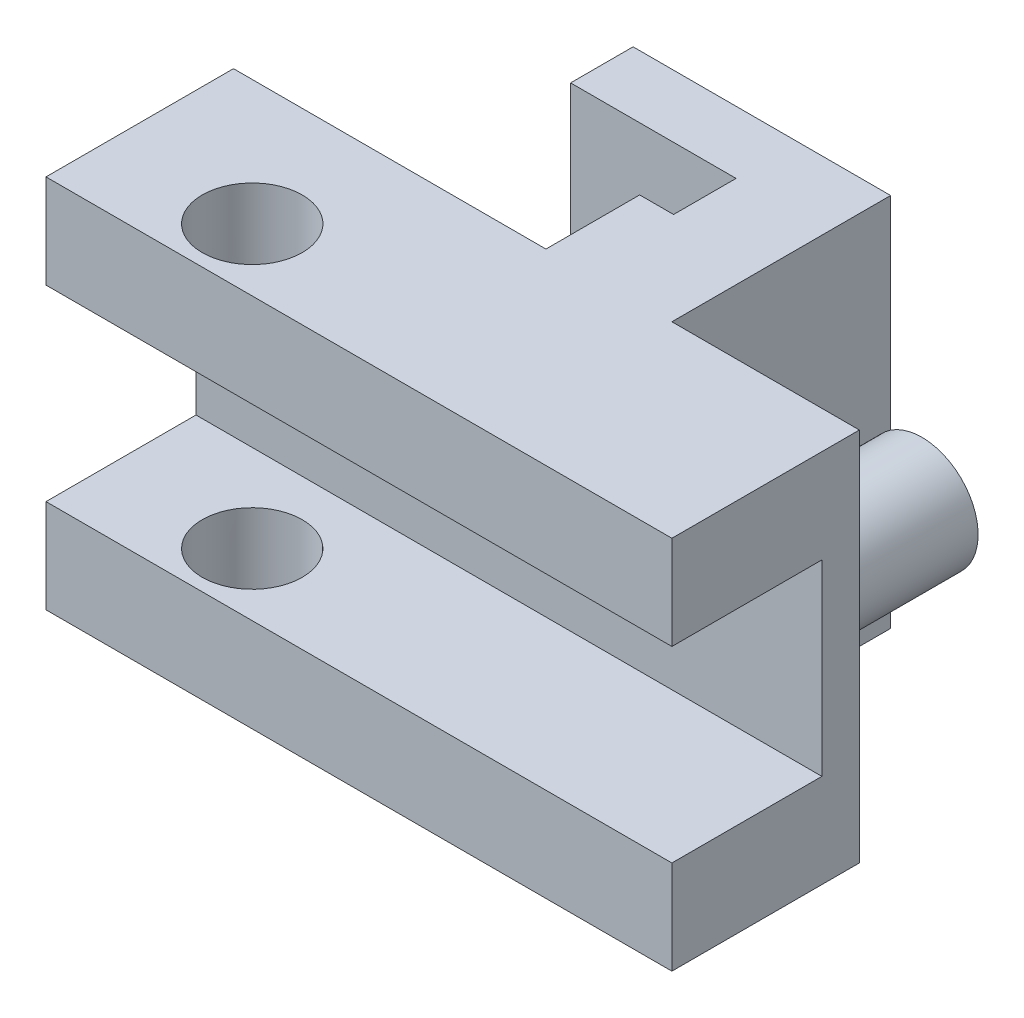
ISO-10303-21;
HEADER;
FILE_DESCRIPTION(('STEP AP214'),'2;1');
FILE_NAME('part.step','',(''),(''),'','','');
FILE_SCHEMA(('AUTOMOTIVE_DESIGN { 1 0 10303 214 1 1 1 1 }'));
ENDSEC;
DATA;
#1=APPLICATION_CONTEXT('core data for automotive mechanical design processes');
#2=APPLICATION_PROTOCOL_DEFINITION('international standard','automotive_design',2000,#1);
#3=PRODUCT_CONTEXT('',#1,'mechanical');
#4=PRODUCT('Part','Part','',(#3));
#5=PRODUCT_RELATED_PRODUCT_CATEGORY('part','',(#4));
#6=PRODUCT_DEFINITION_FORMATION('','',#4);
#7=PRODUCT_DEFINITION_CONTEXT('part definition',#1,'design');
#8=PRODUCT_DEFINITION('design','',#6,#7);
#9=PRODUCT_DEFINITION_SHAPE('','',#8);
#10=(LENGTH_UNIT() NAMED_UNIT(*) SI_UNIT(.MILLI.,.METRE.));
#11=(NAMED_UNIT(*) PLANE_ANGLE_UNIT() SI_UNIT($,.RADIAN.));
#12=(NAMED_UNIT(*) SI_UNIT($,.STERADIAN.) SOLID_ANGLE_UNIT());
#13=UNCERTAINTY_MEASURE_WITH_UNIT(LENGTH_MEASURE(1.E-05),#10,'distance_accuracy_value','');
#14=(GEOMETRIC_REPRESENTATION_CONTEXT(3) GLOBAL_UNCERTAINTY_ASSIGNED_CONTEXT((#13)) GLOBAL_UNIT_ASSIGNED_CONTEXT((#10,
#11,#12)) REPRESENTATION_CONTEXT('',''));
#15=CARTESIAN_POINT('',(0.,0.,0.));
#16=DIRECTION('',(0.,0.,1.));
#17=DIRECTION('',(1.,0.,0.));
#18=AXIS2_PLACEMENT_3D('',#15,#16,#17);
#19=CARTESIAN_POINT('',(0.,3.,-3.51853908965033));
#20=DIRECTION('',(0.,0.,-1.));
#21=DIRECTION('',(-1.,0.,0.));
#22=AXIS2_PLACEMENT_3D('',#19,#20,#21);
#23=PLANE('',#22);
#24=DIRECTION('',(1.,0.,0.));
#25=VECTOR('',#24,1.);
#26=CARTESIAN_POINT('',(0.,2.25,-3.51853908965033));
#27=LINE('',#26,#25);
#28=CARTESIAN_POINT('',(-16.7703220250574,2.25,-3.51853908965033));
#29=VERTEX_POINT('',#28);
#30=CARTESIAN_POINT('',(-11.762486372114,2.25,-3.51853908965033));
#31=VERTEX_POINT('',#30);
#32=EDGE_CURVE('E287',#29,#31,#27,.T.);
#33=ORIENTED_EDGE('',*,*,#32,.T.);
#34=DIRECTION('',(0.,-1.,0.));
#35=VECTOR('',#34,1.);
#36=CARTESIAN_POINT('',(-11.762486372114,3.,-3.51853908965033));
#37=LINE('',#36,#35);
#38=CARTESIAN_POINT('',(-11.762486372114,3.,-3.51853908965033));
#39=VERTEX_POINT('',#38);
#40=EDGE_CURVE('E239',#39,#31,#37,.T.);
#41=ORIENTED_EDGE('',*,*,#40,.F.);
#42=DIRECTION('',(1.,0.,0.));
#43=VECTOR('',#42,1.);
#44=CARTESIAN_POINT('',(0.,3.,-3.51853908965033));
#45=LINE('',#44,#43);
#46=CARTESIAN_POINT('',(-16.7703220250574,3.,-3.51853908965033));
#47=VERTEX_POINT('',#46);
#48=EDGE_CURVE('E68',#47,#39,#45,.T.);
#49=ORIENTED_EDGE('',*,*,#48,.F.);
#50=DIRECTION('',(0.,-1.,0.));
#51=VECTOR('',#50,1.);
#52=CARTESIAN_POINT('',(-16.7703220250574,3.,-3.51853908965033));
#53=LINE('',#52,#51);
#54=EDGE_CURVE('E161',#47,#29,#53,.T.);
#55=ORIENTED_EDGE('',*,*,#54,.T.);
#56=EDGE_LOOP('',(#33,#41,#49,#55));
#57=FACE_BOUND('',#56,.T.);
#58=ADVANCED_FACE('F41',(#57),#23,.F.);
#59=CARTESIAN_POINT('',(-15.6203220250574,3.,-4.01853908965033));
#60=DIRECTION('',(0.,-1.,0.));
#61=DIRECTION('',(0.,0.,-1.));
#62=AXIS2_PLACEMENT_3D('',#59,#60,#61);
#63=CYLINDRICAL_SURFACE('',#62,0.399999999999998);
#64=CARTESIAN_POINT('',(-15.6203220250574,3.,-4.01853908965033));
#65=DIRECTION('',(0.,1.,0.));
#66=DIRECTION('',(0.,0.,1.));
#67=AXIS2_PLACEMENT_3D('',#64,#65,#66);
#68=CIRCLE('',#67,0.399999999999998);
#69=CARTESIAN_POINT('',(-15.6203220250574,3.,-3.61853908965033));
#70=VERTEX_POINT('',#69);
#71=EDGE_CURVE('E186',#70,#70,#68,.T.);
#72=ORIENTED_EDGE('',*,*,#71,.T.);
#73=EDGE_LOOP('',(#72));
#74=FACE_BOUND('',#73,.T.);
#75=CARTESIAN_POINT('',(-15.6203220250574,2.25,-4.01853908965033));
#76=DIRECTION('',(0.,-1.,0.));
#77=DIRECTION('',(0.,0.,-1.));
#78=AXIS2_PLACEMENT_3D('',#75,#76,#77);
#79=CIRCLE('',#78,0.399999999999998);
#80=CARTESIAN_POINT('',(-15.6203220250574,2.25,-4.41853908965033));
#81=VERTEX_POINT('',#80);
#82=EDGE_CURVE('E267',#81,#81,#79,.T.);
#83=ORIENTED_EDGE('',*,*,#82,.T.);
#84=EDGE_LOOP('',(#83));
#85=FACE_BOUND('',#84,.T.);
#86=ADVANCED_FACE('F405',(#74,#85),#63,.F.);
#87=CARTESIAN_POINT('',(-11.762486372114,3.,0.));
#88=DIRECTION('',(1.,0.,0.));
#89=DIRECTION('',(0.,0.,-1.));
#90=AXIS2_PLACEMENT_3D('',#87,#88,#89);
#91=PLANE('',#90);
#92=DIRECTION('',(0.,0.,1.));
#93=VECTOR('',#92,1.);
#94=CARTESIAN_POINT('',(-11.762486372114,0.75,-4.71853908965033));
#95=LINE('',#94,#93);
#96=CARTESIAN_POINT('',(-11.762486372114,0.75,-4.71853908965033));
#97=VERTEX_POINT('',#96);
#98=CARTESIAN_POINT('',(-11.762486372114,0.75,-3.51853908965033));
#99=VERTEX_POINT('',#98);
#100=EDGE_CURVE('E292',#97,#99,#95,.T.);
#101=ORIENTED_EDGE('',*,*,#100,.T.);
#102=CARTESIAN_POINT('',(-11.762486372114,0.,-3.51853908965033));
#103=VERTEX_POINT('',#102);
#104=EDGE_CURVE('E113',#99,#103,#37,.T.);
#105=ORIENTED_EDGE('',*,*,#104,.T.);
#106=DIRECTION('',(0.,0.,1.));
#107=VECTOR('',#106,1.);
#108=CARTESIAN_POINT('',(-11.762486372114,0.,0.));
#109=LINE('',#108,#107);
#110=CARTESIAN_POINT('',(-11.762486372114,0.,-5.01853908965033));
#111=VERTEX_POINT('',#110);
#112=EDGE_CURVE('E190',#111,#103,#109,.T.);
#113=ORIENTED_EDGE('',*,*,#112,.F.);
#114=DIRECTION('',(0.,-1.,0.));
#115=VECTOR('',#114,1.);
#116=CARTESIAN_POINT('',(-11.762486372114,3.,-5.01853908965033));
#117=LINE('',#116,#115);
#118=CARTESIAN_POINT('',(-11.762486372114,3.,-5.01853908965033));
#119=VERTEX_POINT('',#118);
#120=EDGE_CURVE('E11',#119,#111,#117,.T.);
#121=ORIENTED_EDGE('',*,*,#120,.F.);
#122=DIRECTION('',(0.,0.,1.));
#123=VECTOR('',#122,1.);
#124=CARTESIAN_POINT('',(-11.762486372114,3.,0.));
#125=LINE('',#124,#123);
#126=EDGE_CURVE('E238',#119,#39,#125,.T.);
#127=ORIENTED_EDGE('',*,*,#126,.T.);
#128=ORIENTED_EDGE('',*,*,#40,.T.);
#129=DIRECTION('',(0.,0.,1.));
#130=VECTOR('',#129,1.);
#131=CARTESIAN_POINT('',(-11.762486372114,2.25,-4.71853908965033));
#132=LINE('',#131,#130);
#133=CARTESIAN_POINT('',(-11.762486372114,2.25,-4.71853908965033));
#134=VERTEX_POINT('',#133);
#135=EDGE_CURVE('E59',#134,#31,#132,.T.);
#136=ORIENTED_EDGE('',*,*,#135,.F.);
#137=DIRECTION('',(0.,1.,0.));
#138=VECTOR('',#137,1.);
#139=CARTESIAN_POINT('',(-11.762486372114,0.,-4.71853908965033));
#140=LINE('',#139,#138);
#141=EDGE_CURVE('E361',#97,#134,#140,.T.);
#142=ORIENTED_EDGE('',*,*,#141,.F.);
#143=EDGE_LOOP('',(#101,#105,#113,#121,#127,#128,#136,#142));
#144=FACE_BOUND('',#143,.T.);
#145=ADVANCED_FACE('F43',(#144),#91,.T.);
#146=CARTESIAN_POINT('',(0.,3.,-5.01853908965033));
#147=DIRECTION('',(0.,0.,-1.));
#148=DIRECTION('',(-1.,0.,0.));
#149=AXIS2_PLACEMENT_3D('',#146,#147,#148);
#150=PLANE('',#149);
#151=CARTESIAN_POINT('',(-12.512486372114,1.5,-5.01853908965033));
#152=DIRECTION('',(0.,0.,-1.));
#153=DIRECTION('',(-1.,0.,0.));
#154=AXIS2_PLACEMENT_3D('',#151,#152,#153);
#155=CIRCLE('',#154,0.45);
#156=CARTESIAN_POINT('',(-12.962486372114,1.5,-5.01853908965033));
#157=VERTEX_POINT('',#156);
#158=EDGE_CURVE('E352',#157,#157,#155,.T.);
#159=ORIENTED_EDGE('',*,*,#158,.F.);
#160=EDGE_LOOP('',(#159));
#161=FACE_BOUND('',#160,.T.);
#162=DIRECTION('',(1.,0.,0.));
#163=VECTOR('',#162,1.);
#164=CARTESIAN_POINT('',(0.,0.,-5.01853908965033));
#165=LINE('',#164,#163);
#166=CARTESIAN_POINT('',(-13.262486372114,0.,-5.01853908965033));
#167=VERTEX_POINT('',#166);
#168=EDGE_CURVE('E194',#167,#111,#165,.T.);
#169=ORIENTED_EDGE('',*,*,#168,.F.);
#170=DIRECTION('',(0.,-1.,0.));
#171=VECTOR('',#170,1.);
#172=CARTESIAN_POINT('',(-13.262486372114,3.,-5.01853908965033));
#173=LINE('',#172,#171);
#174=CARTESIAN_POINT('',(-13.262486372114,3.,-5.01853908965033));
#175=VERTEX_POINT('',#174);
#176=EDGE_CURVE('E51',#175,#167,#173,.T.);
#177=ORIENTED_EDGE('',*,*,#176,.F.);
#178=DIRECTION('',(1.,0.,0.));
#179=VECTOR('',#178,1.);
#180=CARTESIAN_POINT('',(0.,3.,-5.01853908965033));
#181=LINE('',#180,#179);
#182=EDGE_CURVE('E298',#175,#119,#181,.T.);
#183=ORIENTED_EDGE('',*,*,#182,.T.);
#184=ORIENTED_EDGE('',*,*,#120,.T.);
#185=EDGE_LOOP('',(#169,#177,#183,#184));
#186=FACE_BOUND('',#185,.T.);
#187=ADVANCED_FACE('F374',(#161,#186),#150,.T.);
#188=CARTESIAN_POINT('',(-13.262486372114,3.,0.));
#189=DIRECTION('',(1.,0.,0.));
#190=DIRECTION('',(0.,0.,-1.));
#191=AXIS2_PLACEMENT_3D('',#188,#189,#190);
#192=PLANE('',#191);
#193=DIRECTION('',(0.,0.,1.));
#194=VECTOR('',#193,1.);
#195=CARTESIAN_POINT('',(-13.262486372114,0.,0.));
#196=LINE('',#195,#194);
#197=CARTESIAN_POINT('',(-13.262486372114,0.,-6.76853908965033));
#198=VERTEX_POINT('',#197);
#199=EDGE_CURVE('E198',#198,#167,#196,.T.);
#200=ORIENTED_EDGE('',*,*,#199,.F.);
#201=DIRECTION('',(0.,-1.,0.));
#202=VECTOR('',#201,1.);
#203=CARTESIAN_POINT('',(-13.262486372114,3.,-6.76853908965033));
#204=LINE('',#203,#202);
#205=CARTESIAN_POINT('',(-13.262486372114,3.,-6.76853908965033));
#206=VERTEX_POINT('',#205);
#207=EDGE_CURVE('E263',#206,#198,#204,.T.);
#208=ORIENTED_EDGE('',*,*,#207,.F.);
#209=DIRECTION('',(0.,0.,1.));
#210=VECTOR('',#209,1.);
#211=CARTESIAN_POINT('',(-13.262486372114,3.,0.));
#212=LINE('',#211,#210);
#213=EDGE_CURVE('E302',#206,#175,#212,.T.);
#214=ORIENTED_EDGE('',*,*,#213,.T.);
#215=ORIENTED_EDGE('',*,*,#176,.T.);
#216=EDGE_LOOP('',(#200,#208,#214,#215));
#217=FACE_BOUND('',#216,.T.);
#218=ADVANCED_FACE('F377',(#217),#192,.T.);
#219=CARTESIAN_POINT('',(0.,3.,-6.76853908965033));
#220=DIRECTION('',(0.,0.,-1.));
#221=DIRECTION('',(-1.,0.,0.));
#222=AXIS2_PLACEMENT_3D('',#219,#220,#221);
#223=PLANE('',#222);
#224=DIRECTION('',(1.,0.,0.));
#225=VECTOR('',#224,1.);
#226=CARTESIAN_POINT('',(0.,0.,-6.76853908965033));
#227=LINE('',#226,#225);
#228=CARTESIAN_POINT('',(-15.3229283969067,0.,-6.76853908965033));
#229=VERTEX_POINT('',#228);
#230=EDGE_CURVE('E202',#229,#198,#227,.T.);
#231=ORIENTED_EDGE('',*,*,#230,.F.);
#232=DIRECTION('',(0.,-1.,0.));
#233=VECTOR('',#232,1.);
#234=CARTESIAN_POINT('',(-15.3229283969067,3.,-6.76853908965033));
#235=LINE('',#234,#233);
#236=CARTESIAN_POINT('',(-15.3229283969067,3.,-6.76853908965033));
#237=VERTEX_POINT('',#236);
#238=EDGE_CURVE('E260',#237,#229,#235,.T.);
#239=ORIENTED_EDGE('',*,*,#238,.F.);
#240=DIRECTION('',(1.,0.,0.));
#241=VECTOR('',#240,1.);
#242=CARTESIAN_POINT('',(0.,3.,-6.76853908965033));
#243=LINE('',#242,#241);
#244=EDGE_CURVE('E306',#237,#206,#243,.T.);
#245=ORIENTED_EDGE('',*,*,#244,.T.);
#246=ORIENTED_EDGE('',*,*,#207,.T.);
#247=EDGE_LOOP('',(#231,#239,#245,#246));
#248=FACE_BOUND('',#247,.T.);
#249=ADVANCED_FACE('F387',(#248),#223,.T.);
#250=CARTESIAN_POINT('',(-15.3229283969067,3.,0.));
#251=DIRECTION('',(-1.,0.,0.));
#252=DIRECTION('',(0.,0.,1.));
#253=AXIS2_PLACEMENT_3D('',#250,#251,#252);
#254=PLANE('',#253);
#255=DIRECTION('',(0.,0.,-1.));
#256=VECTOR('',#255,1.);
#257=CARTESIAN_POINT('',(-15.3229283969067,0.,0.));
#258=LINE('',#257,#256);
#259=CARTESIAN_POINT('',(-15.3229283969067,0.,-6.26853908965033));
#260=VERTEX_POINT('',#259);
#261=EDGE_CURVE('E206',#260,#229,#258,.T.);
#262=ORIENTED_EDGE('',*,*,#261,.F.);
#263=DIRECTION('',(0.,-1.,0.));
#264=VECTOR('',#263,1.);
#265=CARTESIAN_POINT('',(-15.3229283969067,3.,-6.26853908965033));
#266=LINE('',#265,#264);
#267=CARTESIAN_POINT('',(-15.3229283969067,3.,-6.26853908965033));
#268=VERTEX_POINT('',#267);
#269=EDGE_CURVE('E257',#268,#260,#266,.T.);
#270=ORIENTED_EDGE('',*,*,#269,.F.);
#271=DIRECTION('',(0.,0.,-1.));
#272=VECTOR('',#271,1.);
#273=CARTESIAN_POINT('',(-15.3229283969067,3.,0.));
#274=LINE('',#273,#272);
#275=EDGE_CURVE('E310',#268,#237,#274,.T.);
#276=ORIENTED_EDGE('',*,*,#275,.T.);
#277=ORIENTED_EDGE('',*,*,#238,.T.);
#278=EDGE_LOOP('',(#262,#270,#276,#277));
#279=FACE_BOUND('',#278,.T.);
#280=ADVANCED_FACE('F390',(#279),#254,.T.);
#281=CARTESIAN_POINT('',(0.,3.,-6.26853908965033));
#282=DIRECTION('',(0.,0.,1.));
#283=DIRECTION('',(1.,0.,0.));
#284=AXIS2_PLACEMENT_3D('',#281,#282,#283);
#285=PLANE('',#284);
#286=DIRECTION('',(-1.,0.,0.));
#287=VECTOR('',#286,1.);
#288=CARTESIAN_POINT('',(0.,0.,-6.26853908965033));
#289=LINE('',#288,#287);
#290=CARTESIAN_POINT('',(-13.9990083706369,0.,-6.26853908965033));
#291=VERTEX_POINT('',#290);
#292=EDGE_CURVE('E210',#291,#260,#289,.T.);
#293=ORIENTED_EDGE('',*,*,#292,.F.);
#294=DIRECTION('',(0.,-1.,0.));
#295=VECTOR('',#294,1.);
#296=CARTESIAN_POINT('',(-13.9990083706369,3.,-6.26853908965033));
#297=LINE('',#296,#295);
#298=CARTESIAN_POINT('',(-13.9990083706369,3.,-6.26853908965033));
#299=VERTEX_POINT('',#298);
#300=EDGE_CURVE('E254',#299,#291,#297,.T.);
#301=ORIENTED_EDGE('',*,*,#300,.F.);
#302=DIRECTION('',(-1.,0.,0.));
#303=VECTOR('',#302,1.);
#304=CARTESIAN_POINT('',(0.,3.,-6.26853908965033));
#305=LINE('',#304,#303);
#306=EDGE_CURVE('E314',#299,#268,#305,.T.);
#307=ORIENTED_EDGE('',*,*,#306,.T.);
#308=ORIENTED_EDGE('',*,*,#269,.T.);
#309=EDGE_LOOP('',(#293,#301,#307,#308));
#310=FACE_BOUND('',#309,.T.);
#311=ADVANCED_FACE('F393',(#310),#285,.T.);
#312=CARTESIAN_POINT('',(-13.9990083706369,3.,0.));
#313=DIRECTION('',(-1.,0.,0.));
#314=DIRECTION('',(0.,0.,1.));
#315=AXIS2_PLACEMENT_3D('',#312,#313,#314);
#316=PLANE('',#315);
#317=DIRECTION('',(0.,0.,-1.));
#318=VECTOR('',#317,1.);
#319=CARTESIAN_POINT('',(-13.9990083706369,0.,0.));
#320=LINE('',#319,#318);
#321=CARTESIAN_POINT('',(-13.9990083706369,0.,-5.76853908965033));
#322=VERTEX_POINT('',#321);
#323=EDGE_CURVE('E214',#322,#291,#320,.T.);
#324=ORIENTED_EDGE('',*,*,#323,.F.);
#325=DIRECTION('',(0.,-1.,0.));
#326=VECTOR('',#325,1.);
#327=CARTESIAN_POINT('',(-13.9990083706369,3.,-5.76853908965033));
#328=LINE('',#327,#326);
#329=CARTESIAN_POINT('',(-13.9990083706369,3.,-5.76853908965033));
#330=VERTEX_POINT('',#329);
#331=EDGE_CURVE('E251',#330,#322,#328,.T.);
#332=ORIENTED_EDGE('',*,*,#331,.F.);
#333=DIRECTION('',(0.,0.,-1.));
#334=VECTOR('',#333,1.);
#335=CARTESIAN_POINT('',(-13.9990083706369,3.,0.));
#336=LINE('',#335,#334);
#337=EDGE_CURVE('E318',#330,#299,#336,.T.);
#338=ORIENTED_EDGE('',*,*,#337,.T.);
#339=ORIENTED_EDGE('',*,*,#300,.T.);
#340=EDGE_LOOP('',(#324,#332,#338,#339));
#341=FACE_BOUND('',#340,.T.);
#342=ADVANCED_FACE('F395',(#341),#316,.T.);
#343=CARTESIAN_POINT('',(0.,3.,-5.76853908965033));
#344=DIRECTION('',(0.,0.,-1.));
#345=DIRECTION('',(-1.,0.,0.));
#346=AXIS2_PLACEMENT_3D('',#343,#344,#345);
#347=PLANE('',#346);
#348=DIRECTION('',(1.,0.,0.));
#349=VECTOR('',#348,1.);
#350=CARTESIAN_POINT('',(0.,0.,-5.76853908965033));
#351=LINE('',#350,#349);
#352=CARTESIAN_POINT('',(-14.2703220250574,0.,-5.76853908965033));
#353=VERTEX_POINT('',#352);
#354=EDGE_CURVE('E218',#353,#322,#351,.T.);
#355=ORIENTED_EDGE('',*,*,#354,.F.);
#356=DIRECTION('',(0.,-1.,0.));
#357=VECTOR('',#356,1.);
#358=CARTESIAN_POINT('',(-14.2703220250574,3.,-5.76853908965033));
#359=LINE('',#358,#357);
#360=CARTESIAN_POINT('',(-14.2703220250574,3.,-5.76853908965033));
#361=VERTEX_POINT('',#360);
#362=EDGE_CURVE('E248',#361,#353,#359,.T.);
#363=ORIENTED_EDGE('',*,*,#362,.F.);
#364=DIRECTION('',(1.,0.,0.));
#365=VECTOR('',#364,1.);
#366=CARTESIAN_POINT('',(0.,3.,-5.76853908965033));
#367=LINE('',#366,#365);
#368=EDGE_CURVE('E180',#361,#330,#367,.T.);
#369=ORIENTED_EDGE('',*,*,#368,.T.);
#370=ORIENTED_EDGE('',*,*,#331,.T.);
#371=EDGE_LOOP('',(#355,#363,#369,#370));
#372=FACE_BOUND('',#371,.T.);
#373=ADVANCED_FACE('F325',(#372),#347,.T.);
#374=CARTESIAN_POINT('',(-14.2703220250574,3.,0.));
#375=DIRECTION('',(-1.,0.,0.));
#376=DIRECTION('',(0.,0.,1.));
#377=AXIS2_PLACEMENT_3D('',#374,#375,#376);
#378=PLANE('',#377);
#379=DIRECTION('',(0.,0.,-1.));
#380=VECTOR('',#379,1.);
#381=CARTESIAN_POINT('',(-14.2703220250574,0.,0.));
#382=LINE('',#381,#380);
#383=CARTESIAN_POINT('',(-14.2703220250574,0.,-5.01853908965033));
#384=VERTEX_POINT('',#383);
#385=EDGE_CURVE('E222',#384,#353,#382,.T.);
#386=ORIENTED_EDGE('',*,*,#385,.F.);
#387=DIRECTION('',(0.,-1.,0.));
#388=VECTOR('',#387,1.);
#389=CARTESIAN_POINT('',(-14.2703220250574,3.,-5.01853908965033));
#390=LINE('',#389,#388);
#391=CARTESIAN_POINT('',(-14.2703220250574,3.,-5.01853908965033));
#392=VERTEX_POINT('',#391);
#393=EDGE_CURVE('E160',#392,#384,#390,.T.);
#394=ORIENTED_EDGE('',*,*,#393,.F.);
#395=DIRECTION('',(0.,0.,-1.));
#396=VECTOR('',#395,1.);
#397=CARTESIAN_POINT('',(-14.2703220250574,3.,0.));
#398=LINE('',#397,#396);
#399=EDGE_CURVE('E176',#392,#361,#398,.T.);
#400=ORIENTED_EDGE('',*,*,#399,.T.);
#401=ORIENTED_EDGE('',*,*,#362,.T.);
#402=EDGE_LOOP('',(#386,#394,#400,#401));
#403=FACE_BOUND('',#402,.T.);
#404=ADVANCED_FACE('F331',(#403),#378,.T.);
#405=CARTESIAN_POINT('',(0.,3.,-5.01853908965033));
#406=DIRECTION('',(0.,0.,-1.));
#407=DIRECTION('',(-1.,0.,0.));
#408=AXIS2_PLACEMENT_3D('',#405,#406,#407);
#409=PLANE('',#408);
#410=DIRECTION('',(1.,0.,0.));
#411=VECTOR('',#410,1.);
#412=CARTESIAN_POINT('',(0.,0.,-5.01853908965033));
#413=LINE('',#412,#411);
#414=CARTESIAN_POINT('',(-16.7703220250574,0.,-5.01853908965033));
#415=VERTEX_POINT('',#414);
#416=EDGE_CURVE('E155',#415,#384,#413,.T.);
#417=ORIENTED_EDGE('',*,*,#416,.F.);
#418=DIRECTION('',(0.,-1.,0.));
#419=VECTOR('',#418,1.);
#420=CARTESIAN_POINT('',(-16.7703220250574,3.,-5.01853908965033));
#421=LINE('',#420,#419);
#422=CARTESIAN_POINT('',(-16.7703220250574,3.,-5.01853908965033));
#423=VERTEX_POINT('',#422);
#424=EDGE_CURVE('E149',#423,#415,#421,.T.);
#425=ORIENTED_EDGE('',*,*,#424,.F.);
#426=DIRECTION('',(1.,0.,0.));
#427=VECTOR('',#426,1.);
#428=CARTESIAN_POINT('',(0.,3.,-5.01853908965033));
#429=LINE('',#428,#427);
#430=EDGE_CURVE('E153',#423,#392,#429,.T.);
#431=ORIENTED_EDGE('',*,*,#430,.T.);
#432=ORIENTED_EDGE('',*,*,#393,.T.);
#433=EDGE_LOOP('',(#417,#425,#431,#432));
#434=FACE_BOUND('',#433,.T.);
#435=ADVANCED_FACE('F151',(#434),#409,.T.);
#436=CARTESIAN_POINT('',(-16.7703220250574,3.,0.));
#437=DIRECTION('',(1.,0.,0.));
#438=DIRECTION('',(0.,0.,-1.));
#439=AXIS2_PLACEMENT_3D('',#436,#437,#438);
#440=PLANE('',#439);
#441=CARTESIAN_POINT('',(-16.7703220250574,0.75,-3.51853908965033));
#442=VERTEX_POINT('',#441);
#443=CARTESIAN_POINT('',(-16.7703220250574,0.,-3.51853908965033));
#444=VERTEX_POINT('',#443);
#445=EDGE_CURVE('E243',#442,#444,#53,.T.);
#446=ORIENTED_EDGE('',*,*,#445,.F.);
#447=DIRECTION('',(0.,0.,1.));
#448=VECTOR('',#447,1.);
#449=CARTESIAN_POINT('',(-16.7703220250574,0.75,-4.71853908965033));
#450=LINE('',#449,#448);
#451=CARTESIAN_POINT('',(-16.7703220250574,0.75,-4.71853908965033));
#452=VERTEX_POINT('',#451);
#453=EDGE_CURVE('E270',#452,#442,#450,.T.);
#454=ORIENTED_EDGE('',*,*,#453,.F.);
#455=DIRECTION('',(0.,-1.,0.));
#456=VECTOR('',#455,1.);
#457=CARTESIAN_POINT('',(-16.7703220250574,0.,-4.71853908965033));
#458=LINE('',#457,#456);
#459=CARTESIAN_POINT('',(-16.7703220250574,2.25,-4.71853908965033));
#460=VERTEX_POINT('',#459);
#461=EDGE_CURVE('E295',#460,#452,#458,.T.);
#462=ORIENTED_EDGE('',*,*,#461,.F.);
#463=DIRECTION('',(0.,0.,1.));
#464=VECTOR('',#463,1.);
#465=CARTESIAN_POINT('',(-16.7703220250574,2.25,-4.71853908965033));
#466=LINE('',#465,#464);
#467=EDGE_CURVE('E277',#460,#29,#466,.T.);
#468=ORIENTED_EDGE('',*,*,#467,.T.);
#469=ORIENTED_EDGE('',*,*,#54,.F.);
#470=DIRECTION('',(0.,0.,1.));
#471=VECTOR('',#470,1.);
#472=CARTESIAN_POINT('',(-16.7703220250574,3.,0.));
#473=LINE('',#472,#471);
#474=EDGE_CURVE('E164',#423,#47,#473,.T.);
#475=ORIENTED_EDGE('',*,*,#474,.F.);
#476=ORIENTED_EDGE('',*,*,#424,.T.);
#477=DIRECTION('',(0.,0.,1.));
#478=VECTOR('',#477,1.);
#479=CARTESIAN_POINT('',(-16.7703220250574,0.,0.));
#480=LINE('',#479,#478);
#481=EDGE_CURVE('E228',#415,#444,#480,.T.);
#482=ORIENTED_EDGE('',*,*,#481,.T.);
#483=EDGE_LOOP('',(#446,#454,#462,#468,#469,#475,#476,#482));
#484=FACE_BOUND('',#483,.T.);
#485=ADVANCED_FACE('F166',(#484),#440,.F.);
#486=ORIENTED_EDGE('',*,*,#104,.F.);
#487=DIRECTION('',(1.,0.,0.));
#488=VECTOR('',#487,1.);
#489=CARTESIAN_POINT('',(0.,0.75,-3.51853908965033));
#490=LINE('',#489,#488);
#491=EDGE_CURVE('E343',#442,#99,#490,.T.);
#492=ORIENTED_EDGE('',*,*,#491,.F.);
#493=ORIENTED_EDGE('',*,*,#445,.T.);
#494=DIRECTION('',(1.,0.,0.));
#495=VECTOR('',#494,1.);
#496=CARTESIAN_POINT('',(0.,0.,-3.51853908965033));
#497=LINE('',#496,#495);
#498=EDGE_CURVE('E231',#444,#103,#497,.T.);
#499=ORIENTED_EDGE('',*,*,#498,.T.);
#500=EDGE_LOOP('',(#486,#492,#493,#499));
#501=FACE_BOUND('',#500,.T.);
#502=ADVANCED_FACE('F342',(#501),#23,.F.);
#503=CARTESIAN_POINT('',(-15.6203220250574,0.75,-4.01853908965033));
#504=DIRECTION('',(0.,-1.,0.));
#505=DIRECTION('',(1.,0.,0.));
#506=AXIS2_PLACEMENT_3D('',#503,#504,#505);
#507=CIRCLE('',#506,0.399999999999998);
#508=CARTESIAN_POINT('',(-15.2203220250574,0.75,-4.01853908965033));
#509=VERTEX_POINT('',#508);
#510=EDGE_CURVE('E45',#509,#509,#507,.T.);
#511=ORIENTED_EDGE('',*,*,#510,.F.);
#512=EDGE_LOOP('',(#511));
#513=FACE_BOUND('',#512,.T.);
#514=CARTESIAN_POINT('',(-15.6203220250574,0.,-4.01853908965033));
#515=DIRECTION('',(0.,1.,0.));
#516=DIRECTION('',(0.,0.,1.));
#517=AXIS2_PLACEMENT_3D('',#514,#515,#516);
#518=CIRCLE('',#517,0.399999999999998);
#519=CARTESIAN_POINT('',(-15.6203220250574,0.,-3.61853908965033));
#520=VERTEX_POINT('',#519);
#521=EDGE_CURVE('E234',#520,#520,#518,.T.);
#522=ORIENTED_EDGE('',*,*,#521,.F.);
#523=EDGE_LOOP('',(#522));
#524=FACE_BOUND('',#523,.T.);
#525=ADVANCED_FACE('F413',(#513,#524),#63,.F.);
#526=CARTESIAN_POINT('',(0.,3.,0.));
#527=DIRECTION('',(0.,1.,0.));
#528=DIRECTION('',(0.,0.,1.));
#529=AXIS2_PLACEMENT_3D('',#526,#527,#528);
#530=PLANE('',#529);
#531=ORIENTED_EDGE('',*,*,#126,.F.);
#532=ORIENTED_EDGE('',*,*,#182,.F.);
#533=ORIENTED_EDGE('',*,*,#213,.F.);
#534=ORIENTED_EDGE('',*,*,#244,.F.);
#535=ORIENTED_EDGE('',*,*,#275,.F.);
#536=ORIENTED_EDGE('',*,*,#306,.F.);
#537=ORIENTED_EDGE('',*,*,#337,.F.);
#538=ORIENTED_EDGE('',*,*,#368,.F.);
#539=ORIENTED_EDGE('',*,*,#399,.F.);
#540=ORIENTED_EDGE('',*,*,#430,.F.);
#541=ORIENTED_EDGE('',*,*,#474,.T.);
#542=ORIENTED_EDGE('',*,*,#48,.T.);
#543=EDGE_LOOP('',(#531,#532,#533,#534,#535,#536,#537,#538,#539,#540,#541,#542));
#544=FACE_BOUND('',#543,.T.);
#545=ORIENTED_EDGE('',*,*,#71,.F.);
#546=EDGE_LOOP('',(#545));
#547=FACE_BOUND('',#546,.T.);
#548=ADVANCED_FACE('F172',(#544,#547),#530,.T.);
#549=CARTESIAN_POINT('',(0.,0.,0.));
#550=DIRECTION('',(0.,1.,0.));
#551=DIRECTION('',(0.,0.,1.));
#552=AXIS2_PLACEMENT_3D('',#549,#550,#551);
#553=PLANE('',#552);
#554=ORIENTED_EDGE('',*,*,#112,.T.);
#555=ORIENTED_EDGE('',*,*,#498,.F.);
#556=ORIENTED_EDGE('',*,*,#481,.F.);
#557=ORIENTED_EDGE('',*,*,#416,.T.);
#558=ORIENTED_EDGE('',*,*,#385,.T.);
#559=ORIENTED_EDGE('',*,*,#354,.T.);
#560=ORIENTED_EDGE('',*,*,#323,.T.);
#561=ORIENTED_EDGE('',*,*,#292,.T.);
#562=ORIENTED_EDGE('',*,*,#261,.T.);
#563=ORIENTED_EDGE('',*,*,#230,.T.);
#564=ORIENTED_EDGE('',*,*,#199,.T.);
#565=ORIENTED_EDGE('',*,*,#168,.T.);
#566=EDGE_LOOP('',(#554,#555,#556,#557,#558,#559,#560,#561,#562,#563,#564,#565));
#567=FACE_BOUND('',#566,.T.);
#568=ORIENTED_EDGE('',*,*,#521,.T.);
#569=EDGE_LOOP('',(#568));
#570=FACE_BOUND('',#569,.T.);
#571=ADVANCED_FACE('F333',(#567,#570),#553,.F.);
#572=CARTESIAN_POINT('',(0.,0.75,-4.71853908965033));
#573=DIRECTION('',(0.,-1.,0.));
#574=DIRECTION('',(1.,0.,0.));
#575=AXIS2_PLACEMENT_3D('',#572,#573,#574);
#576=PLANE('',#575);
#577=ORIENTED_EDGE('',*,*,#510,.T.);
#578=EDGE_LOOP('',(#577));
#579=FACE_BOUND('',#578,.T.);
#580=ORIENTED_EDGE('',*,*,#491,.T.);
#581=ORIENTED_EDGE('',*,*,#100,.F.);
#582=DIRECTION('',(1.,0.,0.));
#583=VECTOR('',#582,1.);
#584=CARTESIAN_POINT('',(0.,0.75,-4.71853908965033));
#585=LINE('',#584,#583);
#586=EDGE_CURVE('E350',#452,#97,#585,.T.);
#587=ORIENTED_EDGE('',*,*,#586,.F.);
#588=ORIENTED_EDGE('',*,*,#453,.T.);
#589=EDGE_LOOP('',(#580,#581,#587,#588));
#590=FACE_BOUND('',#589,.T.);
#591=ADVANCED_FACE('F454',(#579,#590),#576,.F.);
#592=CARTESIAN_POINT('',(0.,2.25,-4.71853908965033));
#593=DIRECTION('',(0.,-1.,0.));
#594=DIRECTION('',(0.,0.,-1.));
#595=AXIS2_PLACEMENT_3D('',#592,#593,#594);
#596=PLANE('',#595);
#597=ORIENTED_EDGE('',*,*,#82,.F.);
#598=EDGE_LOOP('',(#597));
#599=FACE_BOUND('',#598,.T.);
#600=ORIENTED_EDGE('',*,*,#32,.F.);
#601=ORIENTED_EDGE('',*,*,#467,.F.);
#602=DIRECTION('',(1.,0.,0.));
#603=VECTOR('',#602,1.);
#604=CARTESIAN_POINT('',(0.,2.25,-4.71853908965033));
#605=LINE('',#604,#603);
#606=EDGE_CURVE('E358',#460,#134,#605,.T.);
#607=ORIENTED_EDGE('',*,*,#606,.T.);
#608=ORIENTED_EDGE('',*,*,#135,.T.);
#609=EDGE_LOOP('',(#600,#601,#607,#608));
#610=FACE_BOUND('',#609,.T.);
#611=ADVANCED_FACE('F502',(#599,#610),#596,.T.);
#612=CARTESIAN_POINT('',(0.,0.,-4.71853908965033));
#613=DIRECTION('',(0.,0.,1.));
#614=DIRECTION('',(1.,0.,0.));
#615=AXIS2_PLACEMENT_3D('',#612,#613,#614);
#616=PLANE('',#615);
#617=ORIENTED_EDGE('',*,*,#586,.T.);
#618=ORIENTED_EDGE('',*,*,#141,.T.);
#619=ORIENTED_EDGE('',*,*,#606,.F.);
#620=ORIENTED_EDGE('',*,*,#461,.T.);
#621=EDGE_LOOP('',(#617,#618,#619,#620));
#622=FACE_BOUND('',#621,.T.);
#623=ADVANCED_FACE('F512',(#622),#616,.T.);
#624=CARTESIAN_POINT('',(-12.512486372114,1.5,-6.26853908965033));
#625=DIRECTION('',(0.,0.,1.));
#626=DIRECTION('',(1.,0.,0.));
#627=AXIS2_PLACEMENT_3D('',#624,#625,#626);
#628=CYLINDRICAL_SURFACE('',#627,0.45);
#629=CARTESIAN_POINT('',(-12.512486372114,1.5,-6.26853908965033));
#630=DIRECTION('',(0.,0.,-1.));
#631=DIRECTION('',(-1.,0.,0.));
#632=AXIS2_PLACEMENT_3D('',#629,#630,#631);
#633=CIRCLE('',#632,0.45);
#634=CARTESIAN_POINT('',(-12.962486372114,1.5,-6.26853908965033));
#635=VERTEX_POINT('',#634);
#636=EDGE_CURVE('E347',#635,#635,#633,.T.);
#637=ORIENTED_EDGE('',*,*,#636,.F.);
#638=EDGE_LOOP('',(#637));
#639=FACE_BOUND('',#638,.T.);
#640=ORIENTED_EDGE('',*,*,#158,.T.);
#641=EDGE_LOOP('',(#640));
#642=FACE_BOUND('',#641,.T.);
#643=ADVANCED_FACE('F372',(#639,#642),#628,.T.);
#644=CARTESIAN_POINT('',(0.,0.,-6.26853908965033));
#645=DIRECTION('',(0.,0.,-1.));
#646=DIRECTION('',(-1.,0.,0.));
#647=AXIS2_PLACEMENT_3D('',#644,#645,#646);
#648=PLANE('',#647);
#649=ORIENTED_EDGE('',*,*,#636,.T.);
#650=EDGE_LOOP('',(#649));
#651=FACE_BOUND('',#650,.T.);
#652=ADVANCED_FACE('F536',(#651),#648,.T.);
#653=CLOSED_SHELL('',(#58,#86,#145,#187,#218,#249,#280,#311,#342,#373,#404,#435,#485,#502,#525,
#548,#571,#591,#611,#623,#643,#652));
#654=MANIFOLD_SOLID_BREP('B2',#653);
#655=ADVANCED_BREP_SHAPE_REPRESENTATION('',(#18,#654),#14);
#656=SHAPE_DEFINITION_REPRESENTATION(#9,#655);
ENDSEC;
END-ISO-10303-21;
